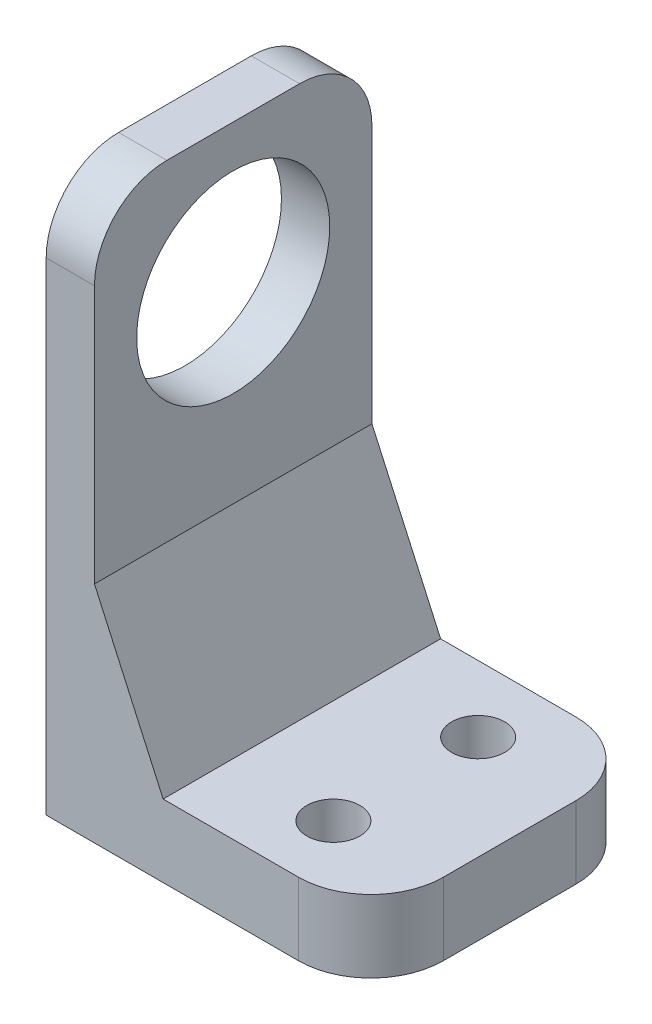
ISO-10303-21;
HEADER;
FILE_DESCRIPTION(('STEP AP214'),'2;1');
FILE_NAME('part.step','',(''),(''),'','','');
FILE_SCHEMA(('AUTOMOTIVE_DESIGN { 1 0 10303 214 1 1 1 1 }'));
ENDSEC;
DATA;
#1=APPLICATION_CONTEXT('core data for automotive mechanical design processes');
#2=APPLICATION_PROTOCOL_DEFINITION('international standard','automotive_design',2000,#1);
#3=PRODUCT_CONTEXT('',#1,'mechanical');
#4=PRODUCT('Part','Part','',(#3));
#5=PRODUCT_RELATED_PRODUCT_CATEGORY('part','',(#4));
#6=PRODUCT_DEFINITION_FORMATION('','',#4);
#7=PRODUCT_DEFINITION_CONTEXT('part definition',#1,'design');
#8=PRODUCT_DEFINITION('design','',#6,#7);
#9=PRODUCT_DEFINITION_SHAPE('','',#8);
#10=(LENGTH_UNIT() NAMED_UNIT(*) SI_UNIT(.MILLI.,.METRE.));
#11=(NAMED_UNIT(*) PLANE_ANGLE_UNIT() SI_UNIT($,.RADIAN.));
#12=(NAMED_UNIT(*) SI_UNIT($,.STERADIAN.) SOLID_ANGLE_UNIT());
#13=UNCERTAINTY_MEASURE_WITH_UNIT(LENGTH_MEASURE(1.E-05),#10,'distance_accuracy_value','');
#14=(GEOMETRIC_REPRESENTATION_CONTEXT(3) GLOBAL_UNCERTAINTY_ASSIGNED_CONTEXT((#13)) GLOBAL_UNIT_ASSIGNED_CONTEXT((#10,
#11,#12)) REPRESENTATION_CONTEXT('',''));
#15=CARTESIAN_POINT('',(0.,0.,0.));
#16=DIRECTION('',(0.,0.,1.));
#17=DIRECTION('',(1.,0.,0.));
#18=AXIS2_PLACEMENT_3D('',#15,#16,#17);
#19=CARTESIAN_POINT('',(-24.9505189931097,3.,5.75));
#20=DIRECTION('',(1.,0.,0.));
#21=DIRECTION('',(0.,0.,-1.));
#22=AXIS2_PLACEMENT_3D('',#19,#20,#21);
#23=PLANE('',#22);
#24=CARTESIAN_POINT('',(-24.9505189931097,17.25,0.));
#25=DIRECTION('',(1.,0.,0.));
#26=DIRECTION('',(0.,0.,-1.));
#27=AXIS2_PLACEMENT_3D('',#24,#25,#26);
#28=CIRCLE('',#27,4.);
#29=CARTESIAN_POINT('',(-24.9505189931097,17.25,-4.));
#30=VERTEX_POINT('',#29);
#31=EDGE_CURVE('E157',#30,#30,#28,.T.);
#32=ORIENTED_EDGE('',*,*,#31,.T.);
#33=EDGE_LOOP('',(#32));
#34=FACE_BOUND('',#33,.T.);
#35=DIRECTION('',(0.,0.,-1.));
#36=VECTOR('',#35,1.);
#37=CARTESIAN_POINT('',(-24.9505189931097,23.,-5.75));
#38=LINE('',#37,#36);
#39=CARTESIAN_POINT('',(-24.9505189931097,23.,2.75));
#40=VERTEX_POINT('',#39);
#41=CARTESIAN_POINT('',(-24.9505189931097,23.,-2.75));
#42=VERTEX_POINT('',#41);
#43=EDGE_CURVE('E133',#40,#42,#38,.T.);
#44=ORIENTED_EDGE('',*,*,#43,.T.);
#45=CARTESIAN_POINT('',(-24.9505189931097,20.,-2.75));
#46=DIRECTION('',(1.,0.,0.));
#47=DIRECTION('',(0.,0.,-1.));
#48=AXIS2_PLACEMENT_3D('',#45,#46,#47);
#49=CIRCLE('',#48,3.);
#50=CARTESIAN_POINT('',(-24.9505189931097,20.,-5.75));
#51=VERTEX_POINT('',#50);
#52=EDGE_CURVE('E201',#42,#51,#49,.F.);
#53=ORIENTED_EDGE('',*,*,#52,.T.);
#54=DIRECTION('',(0.,-1.,0.));
#55=VECTOR('',#54,1.);
#56=CARTESIAN_POINT('',(-24.9505189931097,3.,-5.75));
#57=LINE('',#56,#55);
#58=CARTESIAN_POINT('',(-24.9505189931097,0.,-5.75));
#59=VERTEX_POINT('',#58);
#60=EDGE_CURVE('E172',#51,#59,#57,.T.);
#61=ORIENTED_EDGE('',*,*,#60,.T.);
#62=DIRECTION('',(0.,0.,1.));
#63=VECTOR('',#62,1.);
#64=CARTESIAN_POINT('',(-24.9505189931097,0.,5.75));
#65=LINE('',#64,#63);
#66=CARTESIAN_POINT('',(-24.9505189931097,0.,5.75));
#67=VERTEX_POINT('',#66);
#68=EDGE_CURVE('E164',#59,#67,#65,.T.);
#69=ORIENTED_EDGE('',*,*,#68,.T.);
#70=DIRECTION('',(0.,-1.,0.));
#71=VECTOR('',#70,1.);
#72=CARTESIAN_POINT('',(-24.9505189931097,3.,5.75));
#73=LINE('',#72,#71);
#74=CARTESIAN_POINT('',(-24.9505189931097,20.,5.75));
#75=VERTEX_POINT('',#74);
#76=EDGE_CURVE('E181',#75,#67,#73,.T.);
#77=ORIENTED_EDGE('',*,*,#76,.F.);
#78=CARTESIAN_POINT('',(-24.9505189931097,20.,2.75));
#79=DIRECTION('',(1.,0.,0.));
#80=DIRECTION('',(0.,0.,-1.));
#81=AXIS2_PLACEMENT_3D('',#78,#79,#80);
#82=CIRCLE('',#81,3.);
#83=EDGE_CURVE('E199',#75,#40,#82,.F.);
#84=ORIENTED_EDGE('',*,*,#83,.T.);
#85=EDGE_LOOP('',(#44,#53,#61,#69,#77,#84));
#86=FACE_BOUND('',#85,.T.);
#87=ADVANCED_FACE('F38',(#34,#86),#23,.F.);
#88=CARTESIAN_POINT('',(24.9505189931097,3.,5.75));
#89=DIRECTION('',(0.,0.,-1.));
#90=DIRECTION('',(-1.,0.,0.));
#91=AXIS2_PLACEMENT_3D('',#88,#89,#90);
#92=PLANE('',#91);
#93=DIRECTION('',(1.,0.,0.));
#94=VECTOR('',#93,1.);
#95=CARTESIAN_POINT('',(24.9505189931097,0.,5.75));
#96=LINE('',#95,#94);
#97=CARTESIAN_POINT('',(-14.4932743643124,0.,5.75));
#98=VERTEX_POINT('',#97);
#99=EDGE_CURVE('E175',#67,#98,#96,.T.);
#100=ORIENTED_EDGE('',*,*,#99,.T.);
#101=DIRECTION('',(0.,1.,0.));
#102=VECTOR('',#101,1.);
#103=CARTESIAN_POINT('',(-14.4932743643124,3.,5.75));
#104=LINE('',#103,#102);
#105=CARTESIAN_POINT('',(-14.4932743643124,3.,5.75));
#106=VERTEX_POINT('',#105);
#107=EDGE_CURVE('E11',#98,#106,#104,.T.);
#108=ORIENTED_EDGE('',*,*,#107,.T.);
#109=DIRECTION('',(1.,0.,0.));
#110=VECTOR('',#109,1.);
#111=CARTESIAN_POINT('',(24.9505189931097,3.,5.75));
#112=LINE('',#111,#110);
#113=CARTESIAN_POINT('',(-20.1038775204658,3.,5.75));
#114=VERTEX_POINT('',#113);
#115=EDGE_CURVE('E167',#114,#106,#112,.T.);
#116=ORIENTED_EDGE('',*,*,#115,.F.);
#117=DIRECTION('',(-0.412003987112389,0.911182042515925,0.));
#118=VECTOR('',#117,1.);
#119=CARTESIAN_POINT('',(-20.1038775204658,3.,5.75));
#120=LINE('',#119,#118);
#121=CARTESIAN_POINT('',(-22.9505189931097,9.29559099544974,5.75));
#122=VERTEX_POINT('',#121);
#123=EDGE_CURVE('E143',#114,#122,#120,.T.);
#124=ORIENTED_EDGE('',*,*,#123,.T.);
#125=DIRECTION('',(0.,1.,0.));
#126=VECTOR('',#125,1.);
#127=CARTESIAN_POINT('',(-22.9505189931097,0.,5.75));
#128=LINE('',#127,#126);
#129=CARTESIAN_POINT('',(-22.9505189931097,20.,5.75));
#130=VERTEX_POINT('',#129);
#131=EDGE_CURVE('E132',#122,#130,#128,.T.);
#132=ORIENTED_EDGE('',*,*,#131,.T.);
#133=DIRECTION('',(-1.,0.,0.));
#134=VECTOR('',#133,1.);
#135=CARTESIAN_POINT('',(-24.9505189931097,20.,5.75));
#136=LINE('',#135,#134);
#137=EDGE_CURVE('E208',#130,#75,#136,.T.);
#138=ORIENTED_EDGE('',*,*,#137,.T.);
#139=ORIENTED_EDGE('',*,*,#76,.T.);
#140=EDGE_LOOP('',(#100,#108,#116,#124,#132,#138,#139));
#141=FACE_BOUND('',#140,.T.);
#142=ADVANCED_FACE('F238',(#141),#92,.F.);
#143=CARTESIAN_POINT('',(24.9505189931097,3.,-5.75));
#144=DIRECTION('',(0.,0.,1.));
#145=DIRECTION('',(1.,0.,0.));
#146=AXIS2_PLACEMENT_3D('',#143,#144,#145);
#147=PLANE('',#146);
#148=DIRECTION('',(-1.,0.,0.));
#149=VECTOR('',#148,1.);
#150=CARTESIAN_POINT('',(24.9505189931097,3.,-5.75));
#151=LINE('',#150,#149);
#152=CARTESIAN_POINT('',(-14.4932743643124,3.,-5.75));
#153=VERTEX_POINT('',#152);
#154=CARTESIAN_POINT('',(-20.1038775204658,3.,-5.75));
#155=VERTEX_POINT('',#154);
#156=EDGE_CURVE('E169',#153,#155,#151,.T.);
#157=ORIENTED_EDGE('',*,*,#156,.F.);
#158=DIRECTION('',(0.,-1.,0.));
#159=VECTOR('',#158,1.);
#160=CARTESIAN_POINT('',(-14.4932743643124,3.,-5.75));
#161=LINE('',#160,#159);
#162=CARTESIAN_POINT('',(-14.4932743643124,0.,-5.75));
#163=VERTEX_POINT('',#162);
#164=EDGE_CURVE('E211',#153,#163,#161,.T.);
#165=ORIENTED_EDGE('',*,*,#164,.T.);
#166=DIRECTION('',(-1.,0.,0.));
#167=VECTOR('',#166,1.);
#168=CARTESIAN_POINT('',(24.9505189931097,0.,-5.75));
#169=LINE('',#168,#167);
#170=EDGE_CURVE('E170',#163,#59,#169,.T.);
#171=ORIENTED_EDGE('',*,*,#170,.T.);
#172=ORIENTED_EDGE('',*,*,#60,.F.);
#173=DIRECTION('',(-1.,0.,0.));
#174=VECTOR('',#173,1.);
#175=CARTESIAN_POINT('',(-22.9505189931097,20.,-5.75));
#176=LINE('',#175,#174);
#177=CARTESIAN_POINT('',(-22.9505189931097,20.,-5.75));
#178=VERTEX_POINT('',#177);
#179=EDGE_CURVE('E128',#51,#178,#176,.F.);
#180=ORIENTED_EDGE('',*,*,#179,.T.);
#181=DIRECTION('',(0.,-1.,0.));
#182=VECTOR('',#181,1.);
#183=CARTESIAN_POINT('',(-22.9505189931097,0.,-5.75));
#184=LINE('',#183,#182);
#185=CARTESIAN_POINT('',(-22.9505189931097,9.29559099544974,-5.75));
#186=VERTEX_POINT('',#185);
#187=EDGE_CURVE('E121',#178,#186,#184,.T.);
#188=ORIENTED_EDGE('',*,*,#187,.T.);
#189=DIRECTION('',(-0.412003987112389,0.911182042515925,0.));
#190=VECTOR('',#189,1.);
#191=CARTESIAN_POINT('',(-20.1038775204658,3.,-5.75));
#192=LINE('',#191,#190);
#193=EDGE_CURVE('E125',#155,#186,#192,.T.);
#194=ORIENTED_EDGE('',*,*,#193,.F.);
#195=EDGE_LOOP('',(#157,#165,#171,#172,#180,#188,#194));
#196=FACE_BOUND('',#195,.T.);
#197=ADVANCED_FACE('F124',(#196),#147,.F.);
#198=CARTESIAN_POINT('',(0.,3.,0.));
#199=DIRECTION('',(0.,1.,0.));
#200=DIRECTION('',(0.,0.,1.));
#201=AXIS2_PLACEMENT_3D('',#198,#199,#200);
#202=PLANE('',#201);
#203=CARTESIAN_POINT('',(-15.7985759423891,3.,3.));
#204=DIRECTION('',(0.,1.,0.));
#205=DIRECTION('',(0.,0.,-1.));
#206=AXIS2_PLACEMENT_3D('',#203,#204,#205);
#207=CIRCLE('',#206,1.1);
#208=CARTESIAN_POINT('',(-15.7985759423891,3.,1.9));
#209=VERTEX_POINT('',#208);
#210=EDGE_CURVE('E194',#209,#209,#207,.T.);
#211=ORIENTED_EDGE('',*,*,#210,.F.);
#212=EDGE_LOOP('',(#211));
#213=FACE_BOUND('',#212,.T.);
#214=CARTESIAN_POINT('',(-15.7985759423891,3.,-3.));
#215=DIRECTION('',(0.,1.,0.));
#216=DIRECTION('',(0.,0.,1.));
#217=AXIS2_PLACEMENT_3D('',#214,#215,#216);
#218=CIRCLE('',#217,1.1);
#219=CARTESIAN_POINT('',(-15.7985759423891,3.,-1.9));
#220=VERTEX_POINT('',#219);
#221=EDGE_CURVE('E190',#220,#220,#218,.T.);
#222=ORIENTED_EDGE('',*,*,#221,.F.);
#223=EDGE_LOOP('',(#222));
#224=FACE_BOUND('',#223,.T.);
#225=DIRECTION('',(0.,0.,1.));
#226=VECTOR('',#225,1.);
#227=CARTESIAN_POINT('',(-11.4932743643124,3.,-16.6752688829206));
#228=LINE('',#227,#226);
#229=CARTESIAN_POINT('',(-11.4932743643124,3.,-2.75));
#230=VERTEX_POINT('',#229);
#231=CARTESIAN_POINT('',(-11.4932743643124,3.,2.75));
#232=VERTEX_POINT('',#231);
#233=EDGE_CURVE('E149',#230,#232,#228,.T.);
#234=ORIENTED_EDGE('',*,*,#233,.F.);
#235=CARTESIAN_POINT('',(-14.4932743643124,3.,-2.75));
#236=DIRECTION('',(0.,1.,0.));
#237=DIRECTION('',(0.,0.,1.));
#238=AXIS2_PLACEMENT_3D('',#235,#236,#237);
#239=CIRCLE('',#238,3.);
#240=EDGE_CURVE('E46',#230,#153,#239,.T.);
#241=ORIENTED_EDGE('',*,*,#240,.T.);
#242=ORIENTED_EDGE('',*,*,#156,.T.);
#243=DIRECTION('',(0.,0.,1.));
#244=VECTOR('',#243,1.);
#245=CARTESIAN_POINT('',(-20.1038775204658,3.,-5.75));
#246=LINE('',#245,#244);
#247=EDGE_CURVE('E142',#155,#114,#246,.T.);
#248=ORIENTED_EDGE('',*,*,#247,.T.);
#249=ORIENTED_EDGE('',*,*,#115,.T.);
#250=CARTESIAN_POINT('',(-14.4932743643124,3.,2.75));
#251=DIRECTION('',(0.,1.,0.));
#252=DIRECTION('',(0.,0.,1.));
#253=AXIS2_PLACEMENT_3D('',#250,#251,#252);
#254=CIRCLE('',#253,3.);
#255=EDGE_CURVE('E53',#106,#232,#254,.T.);
#256=ORIENTED_EDGE('',*,*,#255,.T.);
#257=EDGE_LOOP('',(#234,#241,#242,#248,#249,#256));
#258=FACE_BOUND('',#257,.T.);
#259=ADVANCED_FACE('F223',(#213,#224,#258),#202,.T.);
#260=CARTESIAN_POINT('',(0.,0.,0.));
#261=DIRECTION('',(0.,1.,0.));
#262=DIRECTION('',(0.,0.,1.));
#263=AXIS2_PLACEMENT_3D('',#260,#261,#262);
#264=PLANE('',#263);
#265=CARTESIAN_POINT('',(-15.7985759423891,0.,3.));
#266=DIRECTION('',(0.,1.,0.));
#267=DIRECTION('',(0.,0.,1.));
#268=AXIS2_PLACEMENT_3D('',#265,#266,#267);
#269=CIRCLE('',#268,1.1);
#270=CARTESIAN_POINT('',(-15.7985759423891,0.,4.1));
#271=VERTEX_POINT('',#270);
#272=EDGE_CURVE('E191',#271,#271,#269,.T.);
#273=ORIENTED_EDGE('',*,*,#272,.T.);
#274=EDGE_LOOP('',(#273));
#275=FACE_BOUND('',#274,.T.);
#276=CARTESIAN_POINT('',(-15.7985759423891,0.,-3.));
#277=DIRECTION('',(0.,1.,0.));
#278=DIRECTION('',(0.,0.,1.));
#279=AXIS2_PLACEMENT_3D('',#276,#277,#278);
#280=CIRCLE('',#279,1.1);
#281=CARTESIAN_POINT('',(-15.7985759423891,0.,-1.9));
#282=VERTEX_POINT('',#281);
#283=EDGE_CURVE('E187',#282,#282,#280,.T.);
#284=ORIENTED_EDGE('',*,*,#283,.T.);
#285=EDGE_LOOP('',(#284));
#286=FACE_BOUND('',#285,.T.);
#287=ORIENTED_EDGE('',*,*,#170,.F.);
#288=CARTESIAN_POINT('',(-14.4932743643124,0.,-2.75));
#289=DIRECTION('',(0.,1.,0.));
#290=DIRECTION('',(0.,0.,1.));
#291=AXIS2_PLACEMENT_3D('',#288,#289,#290);
#292=CIRCLE('',#291,3.);
#293=CARTESIAN_POINT('',(-11.4932743643124,0.,-2.75));
#294=VERTEX_POINT('',#293);
#295=EDGE_CURVE('E216',#163,#294,#292,.F.);
#296=ORIENTED_EDGE('',*,*,#295,.T.);
#297=DIRECTION('',(0.,0.,1.));
#298=VECTOR('',#297,1.);
#299=CARTESIAN_POINT('',(-11.4932743643124,0.,0.));
#300=LINE('',#299,#298);
#301=CARTESIAN_POINT('',(-11.4932743643124,0.,2.75));
#302=VERTEX_POINT('',#301);
#303=EDGE_CURVE('E183',#294,#302,#300,.T.);
#304=ORIENTED_EDGE('',*,*,#303,.T.);
#305=CARTESIAN_POINT('',(-14.4932743643124,0.,2.75));
#306=DIRECTION('',(0.,1.,0.));
#307=DIRECTION('',(0.,0.,1.));
#308=AXIS2_PLACEMENT_3D('',#305,#306,#307);
#309=CIRCLE('',#308,3.);
#310=EDGE_CURVE('E214',#302,#98,#309,.F.);
#311=ORIENTED_EDGE('',*,*,#310,.T.);
#312=ORIENTED_EDGE('',*,*,#99,.F.);
#313=ORIENTED_EDGE('',*,*,#68,.F.);
#314=EDGE_LOOP('',(#287,#296,#304,#311,#312,#313));
#315=FACE_BOUND('',#314,.T.);
#316=ADVANCED_FACE('F231',(#275,#286,#315),#264,.F.);
#317=CARTESIAN_POINT('',(-22.9505189931097,23.,-5.75));
#318=DIRECTION('',(0.,1.,0.));
#319=DIRECTION('',(0.,0.,1.));
#320=AXIS2_PLACEMENT_3D('',#317,#318,#319);
#321=PLANE('',#320);
#322=DIRECTION('',(0.,0.,-1.));
#323=VECTOR('',#322,1.);
#324=CARTESIAN_POINT('',(-22.9505189931097,23.,-5.75));
#325=LINE('',#324,#323);
#326=CARTESIAN_POINT('',(-22.9505189931097,23.,2.75));
#327=VERTEX_POINT('',#326);
#328=CARTESIAN_POINT('',(-22.9505189931097,23.,-2.75));
#329=VERTEX_POINT('',#328);
#330=EDGE_CURVE('E161',#327,#329,#325,.T.);
#331=ORIENTED_EDGE('',*,*,#330,.T.);
#332=DIRECTION('',(-1.,0.,0.));
#333=VECTOR('',#332,1.);
#334=CARTESIAN_POINT('',(-24.9505189931097,23.,-2.75));
#335=LINE('',#334,#333);
#336=EDGE_CURVE('E196',#329,#42,#335,.T.);
#337=ORIENTED_EDGE('',*,*,#336,.T.);
#338=ORIENTED_EDGE('',*,*,#43,.F.);
#339=DIRECTION('',(-1.,0.,0.));
#340=VECTOR('',#339,1.);
#341=CARTESIAN_POINT('',(-22.9505189931097,23.,2.75));
#342=LINE('',#341,#340);
#343=EDGE_CURVE('E186',#40,#327,#342,.F.);
#344=ORIENTED_EDGE('',*,*,#343,.T.);
#345=EDGE_LOOP('',(#331,#337,#338,#344));
#346=FACE_BOUND('',#345,.T.);
#347=ADVANCED_FACE('F250',(#346),#321,.T.);
#348=CARTESIAN_POINT('',(-22.9505189931097,0.,0.));
#349=DIRECTION('',(1.,0.,0.));
#350=DIRECTION('',(0.,0.,-1.));
#351=AXIS2_PLACEMENT_3D('',#348,#349,#350);
#352=PLANE('',#351);
#353=ORIENTED_EDGE('',*,*,#187,.F.);
#354=CARTESIAN_POINT('',(-22.9505189931097,20.,-2.75));
#355=DIRECTION('',(1.,0.,0.));
#356=DIRECTION('',(0.,0.,-1.));
#357=AXIS2_PLACEMENT_3D('',#354,#355,#356);
#358=CIRCLE('',#357,3.);
#359=EDGE_CURVE('E206',#178,#329,#358,.T.);
#360=ORIENTED_EDGE('',*,*,#359,.T.);
#361=ORIENTED_EDGE('',*,*,#330,.F.);
#362=CARTESIAN_POINT('',(-22.9505189931097,20.,2.75));
#363=DIRECTION('',(1.,0.,0.));
#364=DIRECTION('',(0.,0.,-1.));
#365=AXIS2_PLACEMENT_3D('',#362,#363,#364);
#366=CIRCLE('',#365,3.);
#367=EDGE_CURVE('E204',#327,#130,#366,.T.);
#368=ORIENTED_EDGE('',*,*,#367,.T.);
#369=ORIENTED_EDGE('',*,*,#131,.F.);
#370=DIRECTION('',(0.,0.,1.));
#371=VECTOR('',#370,1.);
#372=CARTESIAN_POINT('',(-22.9505189931097,9.29559099544974,-5.75));
#373=LINE('',#372,#371);
#374=EDGE_CURVE('E139',#186,#122,#373,.T.);
#375=ORIENTED_EDGE('',*,*,#374,.F.);
#376=EDGE_LOOP('',(#353,#360,#361,#368,#369,#375));
#377=FACE_BOUND('',#376,.T.);
#378=CARTESIAN_POINT('',(-22.9505189931097,17.25,0.));
#379=DIRECTION('',(1.,0.,0.));
#380=DIRECTION('',(0.,0.,-1.));
#381=AXIS2_PLACEMENT_3D('',#378,#379,#380);
#382=CIRCLE('',#381,4.);
#383=CARTESIAN_POINT('',(-22.9505189931097,17.25,-4.));
#384=VERTEX_POINT('',#383);
#385=EDGE_CURVE('E154',#384,#384,#382,.T.);
#386=ORIENTED_EDGE('',*,*,#385,.F.);
#387=EDGE_LOOP('',(#386));
#388=FACE_BOUND('',#387,.T.);
#389=ADVANCED_FACE('F145',(#377,#388),#352,.T.);
#390=CARTESIAN_POINT('',(-25.9505189931097,17.25,0.));
#391=DIRECTION('',(1.,0.,0.));
#392=DIRECTION('',(0.,0.,-1.));
#393=AXIS2_PLACEMENT_3D('',#390,#391,#392);
#394=CYLINDRICAL_SURFACE('',#393,4.);
#395=ORIENTED_EDGE('',*,*,#385,.T.);
#396=EDGE_LOOP('',(#395));
#397=FACE_BOUND('',#396,.T.);
#398=ORIENTED_EDGE('',*,*,#31,.F.);
#399=EDGE_LOOP('',(#398));
#400=FACE_BOUND('',#399,.T.);
#401=ADVANCED_FACE('F312',(#397,#400),#394,.F.);
#402=CARTESIAN_POINT('',(-11.4932743643124,-7.,-16.6752688829206));
#403=DIRECTION('',(-1.,0.,0.));
#404=DIRECTION('',(0.,0.,1.));
#405=AXIS2_PLACEMENT_3D('',#402,#403,#404);
#406=PLANE('',#405);
#407=ORIENTED_EDGE('',*,*,#303,.F.);
#408=DIRECTION('',(0.,-1.,0.));
#409=VECTOR('',#408,1.);
#410=CARTESIAN_POINT('',(-11.4932743643124,-7.,-2.75));
#411=LINE('',#410,#409);
#412=EDGE_CURVE('E220',#294,#230,#411,.F.);
#413=ORIENTED_EDGE('',*,*,#412,.T.);
#414=ORIENTED_EDGE('',*,*,#233,.T.);
#415=DIRECTION('',(0.,1.,0.));
#416=VECTOR('',#415,1.);
#417=CARTESIAN_POINT('',(-11.4932743643124,-7.,2.75));
#418=LINE('',#417,#416);
#419=EDGE_CURVE('E218',#232,#302,#418,.F.);
#420=ORIENTED_EDGE('',*,*,#419,.T.);
#421=EDGE_LOOP('',(#407,#413,#414,#420));
#422=FACE_BOUND('',#421,.T.);
#423=ADVANCED_FACE('F235',(#422),#406,.F.);
#424=CARTESIAN_POINT('',(-20.1038775204658,3.,-5.75));
#425=DIRECTION('',(0.911182042515926,0.412003987112389,0.));
#426=DIRECTION('',(-0.412003987112389,0.911182042515926,0.));
#427=AXIS2_PLACEMENT_3D('',#424,#425,#426);
#428=PLANE('',#427);
#429=ORIENTED_EDGE('',*,*,#123,.F.);
#430=ORIENTED_EDGE('',*,*,#247,.F.);
#431=ORIENTED_EDGE('',*,*,#193,.T.);
#432=ORIENTED_EDGE('',*,*,#374,.T.);
#433=EDGE_LOOP('',(#429,#430,#431,#432));
#434=FACE_BOUND('',#433,.T.);
#435=ADVANCED_FACE('F138',(#434),#428,.T.);
#436=CARTESIAN_POINT('',(-15.7985759423891,-7.,-3.));
#437=DIRECTION('',(0.,1.,0.));
#438=DIRECTION('',(0.,0.,1.));
#439=AXIS2_PLACEMENT_3D('',#436,#437,#438);
#440=CYLINDRICAL_SURFACE('',#439,1.1);
#441=ORIENTED_EDGE('',*,*,#221,.T.);
#442=EDGE_LOOP('',(#441));
#443=FACE_BOUND('',#442,.T.);
#444=ORIENTED_EDGE('',*,*,#283,.F.);
#445=EDGE_LOOP('',(#444));
#446=FACE_BOUND('',#445,.T.);
#447=ADVANCED_FACE('F268',(#443,#446),#440,.F.);
#448=CARTESIAN_POINT('',(-15.7985759423891,-7.,3.));
#449=DIRECTION('',(0.,1.,0.));
#450=DIRECTION('',(0.,0.,1.));
#451=AXIS2_PLACEMENT_3D('',#448,#449,#450);
#452=CYLINDRICAL_SURFACE('',#451,1.1);
#453=ORIENTED_EDGE('',*,*,#210,.T.);
#454=EDGE_LOOP('',(#453));
#455=FACE_BOUND('',#454,.T.);
#456=ORIENTED_EDGE('',*,*,#272,.F.);
#457=EDGE_LOOP('',(#456));
#458=FACE_BOUND('',#457,.T.);
#459=ADVANCED_FACE('F260',(#455,#458),#452,.F.);
#460=CARTESIAN_POINT('',(-22.9505189931097,20.,-2.75));
#461=DIRECTION('',(1.,0.,0.));
#462=DIRECTION('',(0.,0.,-1.));
#463=AXIS2_PLACEMENT_3D('',#460,#461,#462);
#464=CYLINDRICAL_SURFACE('',#463,3.);
#465=ORIENTED_EDGE('',*,*,#359,.F.);
#466=ORIENTED_EDGE('',*,*,#179,.F.);
#467=ORIENTED_EDGE('',*,*,#52,.F.);
#468=ORIENTED_EDGE('',*,*,#336,.F.);
#469=EDGE_LOOP('',(#465,#466,#467,#468));
#470=FACE_BOUND('',#469,.T.);
#471=ADVANCED_FACE('F245',(#470),#464,.T.);
#472=CARTESIAN_POINT('',(24.9505189931097,20.,2.75));
#473=DIRECTION('',(1.,0.,0.));
#474=DIRECTION('',(0.,0.,-1.));
#475=AXIS2_PLACEMENT_3D('',#472,#473,#474);
#476=CYLINDRICAL_SURFACE('',#475,3.);
#477=ORIENTED_EDGE('',*,*,#367,.F.);
#478=ORIENTED_EDGE('',*,*,#343,.F.);
#479=ORIENTED_EDGE('',*,*,#83,.F.);
#480=ORIENTED_EDGE('',*,*,#137,.F.);
#481=EDGE_LOOP('',(#477,#478,#479,#480));
#482=FACE_BOUND('',#481,.T.);
#483=ADVANCED_FACE('F253',(#482),#476,.T.);
#484=CARTESIAN_POINT('',(-14.4932743643124,3.,-2.75));
#485=DIRECTION('',(0.,-1.,0.));
#486=DIRECTION('',(0.,0.,-1.));
#487=AXIS2_PLACEMENT_3D('',#484,#485,#486);
#488=CYLINDRICAL_SURFACE('',#487,3.);
#489=ORIENTED_EDGE('',*,*,#240,.F.);
#490=ORIENTED_EDGE('',*,*,#412,.F.);
#491=ORIENTED_EDGE('',*,*,#295,.F.);
#492=ORIENTED_EDGE('',*,*,#164,.F.);
#493=EDGE_LOOP('',(#489,#490,#491,#492));
#494=FACE_BOUND('',#493,.T.);
#495=ADVANCED_FACE('F228',(#494),#488,.T.);
#496=CARTESIAN_POINT('',(-14.4932743643124,3.,2.75));
#497=DIRECTION('',(0.,1.,0.));
#498=DIRECTION('',(0.,0.,1.));
#499=AXIS2_PLACEMENT_3D('',#496,#497,#498);
#500=CYLINDRICAL_SURFACE('',#499,3.);
#501=ORIENTED_EDGE('',*,*,#310,.F.);
#502=ORIENTED_EDGE('',*,*,#419,.F.);
#503=ORIENTED_EDGE('',*,*,#255,.F.);
#504=ORIENTED_EDGE('',*,*,#107,.F.);
#505=EDGE_LOOP('',(#501,#502,#503,#504));
#506=FACE_BOUND('',#505,.T.);
#507=ADVANCED_FACE('F40',(#506),#500,.T.);
#508=CLOSED_SHELL('',(#87,#142,#197,#259,#316,#347,#389,#401,#423,#435,#447,#459,#471,#483,#495,#507));
#509=MANIFOLD_SOLID_BREP('B2',#508);
#510=ADVANCED_BREP_SHAPE_REPRESENTATION('',(#18,#509),#14);
#511=SHAPE_DEFINITION_REPRESENTATION(#9,#510);
ENDSEC;
END-ISO-10303-21;
